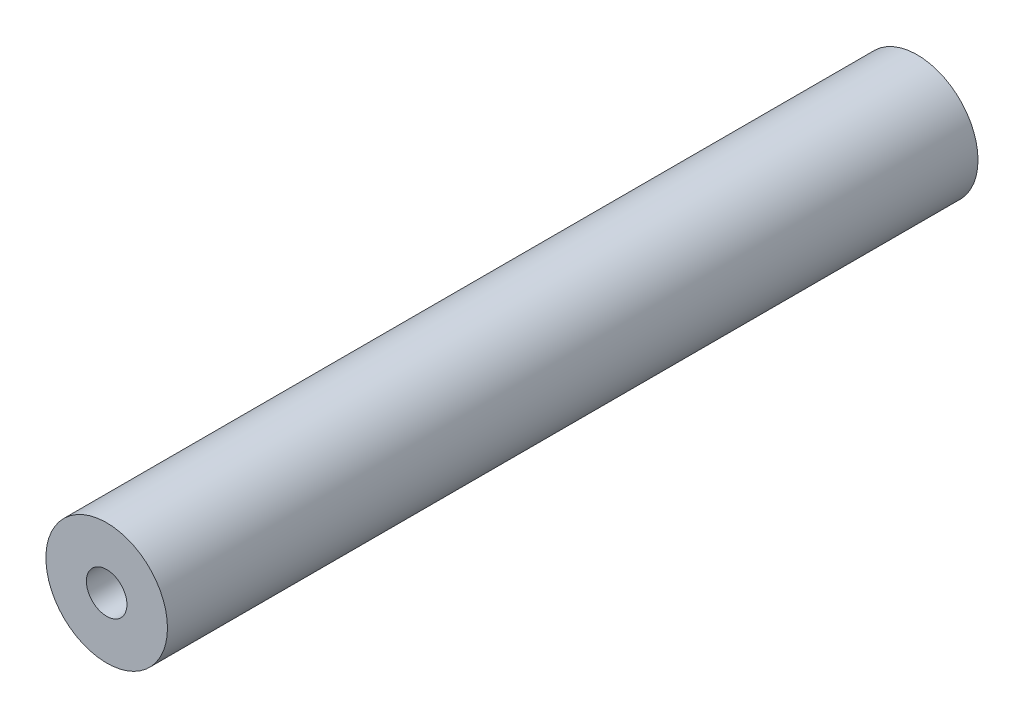
ISO-10303-21;
HEADER;
FILE_DESCRIPTION(('STEP AP214'),'2;1');
FILE_NAME('part.step','',(''),(''),'','','');
FILE_SCHEMA(('AUTOMOTIVE_DESIGN { 1 0 10303 214 1 1 1 1 }'));
ENDSEC;
DATA;
#1=APPLICATION_CONTEXT('core data for automotive mechanical design processes');
#2=APPLICATION_PROTOCOL_DEFINITION('international standard','automotive_design',2000,#1);
#3=PRODUCT_CONTEXT('',#1,'mechanical');
#4=PRODUCT('Part','Part','',(#3));
#5=PRODUCT_RELATED_PRODUCT_CATEGORY('part','',(#4));
#6=PRODUCT_DEFINITION_FORMATION('','',#4);
#7=PRODUCT_DEFINITION_CONTEXT('part definition',#1,'design');
#8=PRODUCT_DEFINITION('design','',#6,#7);
#9=PRODUCT_DEFINITION_SHAPE('','',#8);
#10=(LENGTH_UNIT() NAMED_UNIT(*) SI_UNIT(.MILLI.,.METRE.));
#11=(NAMED_UNIT(*) PLANE_ANGLE_UNIT() SI_UNIT($,.RADIAN.));
#12=(NAMED_UNIT(*) SI_UNIT($,.STERADIAN.) SOLID_ANGLE_UNIT());
#13=UNCERTAINTY_MEASURE_WITH_UNIT(LENGTH_MEASURE(1.E-05),#10,'distance_accuracy_value','');
#14=(GEOMETRIC_REPRESENTATION_CONTEXT(3) GLOBAL_UNCERTAINTY_ASSIGNED_CONTEXT((#13)) GLOBAL_UNIT_ASSIGNED_CONTEXT((#10,
#11,#12)) REPRESENTATION_CONTEXT('',''));
#15=CARTESIAN_POINT('',(0.,0.,0.));
#16=DIRECTION('',(0.,0.,1.));
#17=DIRECTION('',(1.,0.,0.));
#18=AXIS2_PLACEMENT_3D('',#15,#16,#17);
#19=CARTESIAN_POINT('',(0.,0.,100.));
#20=DIRECTION('',(0.,0.,1.));
#21=DIRECTION('',(1.,0.,0.));
#22=AXIS2_PLACEMENT_3D('',#19,#20,#21);
#23=PLANE('',#22);
#24=CARTESIAN_POINT('',(0.,0.,100.));
#25=DIRECTION('',(0.,0.,1.));
#26=DIRECTION('',(1.,0.,0.));
#27=AXIS2_PLACEMENT_3D('',#24,#25,#26);
#28=CIRCLE('',#27,7.5);
#29=CARTESIAN_POINT('',(7.5,0.,100.));
#30=VERTEX_POINT('',#29);
#31=EDGE_CURVE('E10',#30,#30,#28,.T.);
#32=ORIENTED_EDGE('',*,*,#31,.T.);
#33=EDGE_LOOP('',(#32));
#34=FACE_BOUND('',#33,.T.);
#35=CARTESIAN_POINT('',(0.,0.,100.));
#36=DIRECTION('',(0.,0.,1.));
#37=DIRECTION('',(1.,0.,0.));
#38=AXIS2_PLACEMENT_3D('',#35,#36,#37);
#39=CIRCLE('',#38,2.5);
#40=CARTESIAN_POINT('',(2.5,0.,100.));
#41=VERTEX_POINT('',#40);
#42=EDGE_CURVE('E44',#41,#41,#39,.T.);
#43=ORIENTED_EDGE('',*,*,#42,.F.);
#44=EDGE_LOOP('',(#43));
#45=FACE_BOUND('',#44,.T.);
#46=ADVANCED_FACE('F33',(#34,#45),#23,.T.);
#47=CARTESIAN_POINT('',(0.,0.,0.));
#48=DIRECTION('',(0.,0.,1.));
#49=DIRECTION('',(1.,0.,0.));
#50=AXIS2_PLACEMENT_3D('',#47,#48,#49);
#51=PLANE('',#50);
#52=CARTESIAN_POINT('',(0.,0.,0.));
#53=DIRECTION('',(0.,0.,1.));
#54=DIRECTION('',(1.,0.,0.));
#55=AXIS2_PLACEMENT_3D('',#52,#53,#54);
#56=CIRCLE('',#55,7.5);
#57=CARTESIAN_POINT('',(7.5,0.,0.));
#58=VERTEX_POINT('',#57);
#59=EDGE_CURVE('E37',#58,#58,#56,.T.);
#60=ORIENTED_EDGE('',*,*,#59,.F.);
#61=EDGE_LOOP('',(#60));
#62=FACE_BOUND('',#61,.T.);
#63=CARTESIAN_POINT('',(0.,0.,0.));
#64=DIRECTION('',(0.,0.,1.));
#65=DIRECTION('',(1.,0.,0.));
#66=AXIS2_PLACEMENT_3D('',#63,#64,#65);
#67=CIRCLE('',#66,2.5);
#68=CARTESIAN_POINT('',(2.5,0.,0.));
#69=VERTEX_POINT('',#68);
#70=EDGE_CURVE('E46',#69,#69,#67,.T.);
#71=ORIENTED_EDGE('',*,*,#70,.T.);
#72=EDGE_LOOP('',(#71));
#73=FACE_BOUND('',#72,.T.);
#74=ADVANCED_FACE('F56',(#62,#73),#51,.F.);
#75=CARTESIAN_POINT('',(0.,0.,100.));
#76=DIRECTION('',(0.,0.,-1.));
#77=DIRECTION('',(-1.,0.,0.));
#78=AXIS2_PLACEMENT_3D('',#75,#76,#77);
#79=CYLINDRICAL_SURFACE('',#78,7.5);
#80=ORIENTED_EDGE('',*,*,#31,.F.);
#81=EDGE_LOOP('',(#80));
#82=FACE_BOUND('',#81,.T.);
#83=ORIENTED_EDGE('',*,*,#59,.T.);
#84=EDGE_LOOP('',(#83));
#85=FACE_BOUND('',#84,.T.);
#86=ADVANCED_FACE('F35',(#82,#85),#79,.T.);
#87=CARTESIAN_POINT('',(0.,0.,100.));
#88=DIRECTION('',(0.,0.,-1.));
#89=DIRECTION('',(-1.,0.,0.));
#90=AXIS2_PLACEMENT_3D('',#87,#88,#89);
#91=CYLINDRICAL_SURFACE('',#90,2.5);
#92=ORIENTED_EDGE('',*,*,#42,.T.);
#93=EDGE_LOOP('',(#92));
#94=FACE_BOUND('',#93,.T.);
#95=ORIENTED_EDGE('',*,*,#70,.F.);
#96=EDGE_LOOP('',(#95));
#97=FACE_BOUND('',#96,.T.);
#98=ADVANCED_FACE('F52',(#94,#97),#91,.F.);
#99=CLOSED_SHELL('',(#46,#74,#86,#98));
#100=MANIFOLD_SOLID_BREP('B2',#99);
#101=ADVANCED_BREP_SHAPE_REPRESENTATION('',(#18,#100),#14);
#102=SHAPE_DEFINITION_REPRESENTATION(#9,#101);
ENDSEC;
END-ISO-10303-21;
